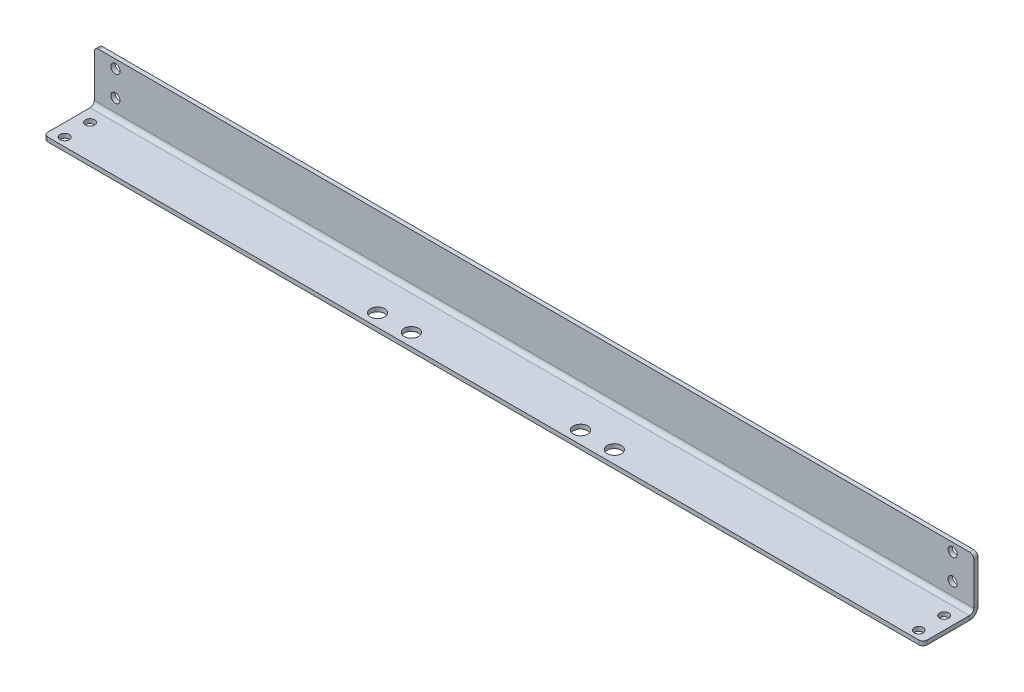
ISO-10303-21;
HEADER;
FILE_DESCRIPTION(('STEP AP214'),'2;1');
FILE_NAME('part.step','',(''),(''),'','','');
FILE_SCHEMA(('AUTOMOTIVE_DESIGN { 1 0 10303 214 1 1 1 1 }'));
ENDSEC;
DATA;
#1=APPLICATION_CONTEXT('core data for automotive mechanical design processes');
#2=APPLICATION_PROTOCOL_DEFINITION('international standard','automotive_design',2000,#1);
#3=PRODUCT_CONTEXT('',#1,'mechanical');
#4=PRODUCT('Part','Part','',(#3));
#5=PRODUCT_RELATED_PRODUCT_CATEGORY('part','',(#4));
#6=PRODUCT_DEFINITION_FORMATION('','',#4);
#7=PRODUCT_DEFINITION_CONTEXT('part definition',#1,'design');
#8=PRODUCT_DEFINITION('design','',#6,#7);
#9=PRODUCT_DEFINITION_SHAPE('','',#8);
#10=(LENGTH_UNIT() NAMED_UNIT(*) SI_UNIT(.MILLI.,.METRE.));
#11=(NAMED_UNIT(*) PLANE_ANGLE_UNIT() SI_UNIT($,.RADIAN.));
#12=(NAMED_UNIT(*) SI_UNIT($,.STERADIAN.) SOLID_ANGLE_UNIT());
#13=UNCERTAINTY_MEASURE_WITH_UNIT(LENGTH_MEASURE(1.E-05),#10,'distance_accuracy_value','');
#14=(GEOMETRIC_REPRESENTATION_CONTEXT(3) GLOBAL_UNCERTAINTY_ASSIGNED_CONTEXT((#13)) GLOBAL_UNIT_ASSIGNED_CONTEXT((#10,
#11,#12)) REPRESENTATION_CONTEXT('',''));
#15=CARTESIAN_POINT('',(0.,0.,0.));
#16=DIRECTION('',(0.,0.,1.));
#17=DIRECTION('',(1.,0.,0.));
#18=AXIS2_PLACEMENT_3D('',#15,#16,#17);
#19=CARTESIAN_POINT('',(660.4,3.175,-38.1));
#20=DIRECTION('',(1.,0.,0.));
#21=DIRECTION('',(0.,0.,-1.));
#22=AXIS2_PLACEMENT_3D('',#19,#20,#21);
#23=PLANE('',#22);
#24=DIRECTION('',(0.,0.,-1.));
#25=VECTOR('',#24,1.);
#26=CARTESIAN_POINT('',(660.4,3.175,-38.1));
#27=LINE('',#26,#25);
#28=CARTESIAN_POINT('',(660.4,3.175,-38.1));
#29=VERTEX_POINT('',#28);
#30=CARTESIAN_POINT('',(660.4,3.175,-41.275));
#31=VERTEX_POINT('',#30);
#32=EDGE_CURVE('E363',#29,#31,#27,.T.);
#33=ORIENTED_EDGE('',*,*,#32,.F.);
#34=CARTESIAN_POINT('',(660.4,3.175,-34.925));
#35=DIRECTION('',(-1.,0.,0.));
#36=DIRECTION('',(0.,0.,1.));
#37=AXIS2_PLACEMENT_3D('',#34,#35,#36);
#38=CIRCLE('',#37,3.175);
#39=CARTESIAN_POINT('',(660.4,0.,-34.925));
#40=VERTEX_POINT('',#39);
#41=EDGE_CURVE('E367',#40,#29,#38,.F.);
#42=ORIENTED_EDGE('',*,*,#41,.F.);
#43=DIRECTION('',(0.,1.,0.));
#44=VECTOR('',#43,1.);
#45=CARTESIAN_POINT('',(660.4,-3.175,-34.9249999999999));
#46=LINE('',#45,#44);
#47=CARTESIAN_POINT('',(660.4,-3.175,-34.9249999999999));
#48=VERTEX_POINT('',#47);
#49=EDGE_CURVE('E373',#48,#40,#46,.T.);
#50=ORIENTED_EDGE('',*,*,#49,.F.);
#51=CARTESIAN_POINT('',(660.4,3.175,-34.925));
#52=DIRECTION('',(1.,0.,0.));
#53=DIRECTION('',(0.,0.,-1.));
#54=AXIS2_PLACEMENT_3D('',#51,#52,#53);
#55=CIRCLE('',#54,6.35);
#56=EDGE_CURVE('E369',#48,#31,#55,.T.);
#57=ORIENTED_EDGE('',*,*,#56,.T.);
#58=EDGE_LOOP('',(#33,#42,#50,#57));
#59=FACE_BOUND('',#58,.T.);
#60=ADVANCED_FACE('F269',(#59),#23,.T.);
#61=CARTESIAN_POINT('',(660.4,-3.175,-34.9249999999999));
#62=DIRECTION('',(1.,0.,0.));
#63=DIRECTION('',(0.,0.,-1.));
#64=AXIS2_PLACEMENT_3D('',#61,#62,#63);
#65=PLANE('',#64);
#66=DIRECTION('',(0.,1.,0.));
#67=VECTOR('',#66,1.);
#68=CARTESIAN_POINT('',(660.4,0.,-41.275));
#69=LINE('',#68,#67);
#70=CARTESIAN_POINT('',(660.4,34.925,-41.275));
#71=VERTEX_POINT('',#70);
#72=EDGE_CURVE('E390',#31,#71,#69,.T.);
#73=ORIENTED_EDGE('',*,*,#72,.T.);
#74=DIRECTION('',(0.,0.,-1.));
#75=VECTOR('',#74,1.);
#76=CARTESIAN_POINT('',(660.4,34.925,-34.9249999999999));
#77=LINE('',#76,#75);
#78=CARTESIAN_POINT('',(660.4,34.925,-38.1));
#79=VERTEX_POINT('',#78);
#80=EDGE_CURVE('E293',#71,#79,#77,.F.);
#81=ORIENTED_EDGE('',*,*,#80,.T.);
#82=DIRECTION('',(0.,1.,0.));
#83=VECTOR('',#82,1.);
#84=CARTESIAN_POINT('',(660.4,0.,-38.1));
#85=LINE('',#84,#83);
#86=EDGE_CURVE('E378',#29,#79,#85,.T.);
#87=ORIENTED_EDGE('',*,*,#86,.F.);
#88=ORIENTED_EDGE('',*,*,#32,.T.);
#89=EDGE_LOOP('',(#73,#81,#87,#88));
#90=FACE_BOUND('',#89,.T.);
#91=ADVANCED_FACE('F388',(#90),#65,.T.);
#92=CARTESIAN_POINT('',(0.,0.,-34.925));
#93=DIRECTION('',(-1.,0.,0.));
#94=DIRECTION('',(0.,0.,1.));
#95=AXIS2_PLACEMENT_3D('',#92,#93,#94);
#96=PLANE('',#95);
#97=DIRECTION('',(0.,-1.,0.));
#98=VECTOR('',#97,1.);
#99=CARTESIAN_POINT('',(0.,0.,-34.925));
#100=LINE('',#99,#98);
#101=CARTESIAN_POINT('',(0.,0.,-34.925));
#102=VERTEX_POINT('',#101);
#103=CARTESIAN_POINT('',(0.,-3.175,-34.9249999999999));
#104=VERTEX_POINT('',#103);
#105=EDGE_CURVE('E455',#102,#104,#100,.T.);
#106=ORIENTED_EDGE('',*,*,#105,.F.);
#107=CARTESIAN_POINT('',(0.,3.175,-34.925));
#108=DIRECTION('',(-1.,0.,0.));
#109=DIRECTION('',(0.,0.,1.));
#110=AXIS2_PLACEMENT_3D('',#107,#108,#109);
#111=CIRCLE('',#110,3.175);
#112=CARTESIAN_POINT('',(0.,3.175,-38.1));
#113=VERTEX_POINT('',#112);
#114=EDGE_CURVE('E416',#102,#113,#111,.F.);
#115=ORIENTED_EDGE('',*,*,#114,.T.);
#116=DIRECTION('',(0.,0.,1.));
#117=VECTOR('',#116,1.);
#118=CARTESIAN_POINT('',(0.,3.175,-41.275));
#119=LINE('',#118,#117);
#120=CARTESIAN_POINT('',(0.,3.175,-41.275));
#121=VERTEX_POINT('',#120);
#122=EDGE_CURVE('E452',#121,#113,#119,.T.);
#123=ORIENTED_EDGE('',*,*,#122,.F.);
#124=CARTESIAN_POINT('',(0.,3.175,-34.925));
#125=DIRECTION('',(1.,0.,0.));
#126=DIRECTION('',(0.,0.,-1.));
#127=AXIS2_PLACEMENT_3D('',#124,#125,#126);
#128=CIRCLE('',#127,6.35);
#129=EDGE_CURVE('E425',#104,#121,#128,.T.);
#130=ORIENTED_EDGE('',*,*,#129,.F.);
#131=EDGE_LOOP('',(#106,#115,#123,#130));
#132=FACE_BOUND('',#131,.T.);
#133=ADVANCED_FACE('F648',(#132),#96,.T.);
#134=CARTESIAN_POINT('',(0.,3.175,-41.275));
#135=DIRECTION('',(-1.,0.,0.));
#136=DIRECTION('',(0.,0.,1.));
#137=AXIS2_PLACEMENT_3D('',#134,#135,#136);
#138=PLANE('',#137);
#139=DIRECTION('',(0.,0.,-1.));
#140=VECTOR('',#139,1.);
#141=CARTESIAN_POINT('',(0.,-3.175,0.));
#142=LINE('',#141,#140);
#143=CARTESIAN_POINT('',(0.,-3.175,-3.175));
#144=VERTEX_POINT('',#143);
#145=EDGE_CURVE('E422',#144,#104,#142,.T.);
#146=ORIENTED_EDGE('',*,*,#145,.F.);
#147=DIRECTION('',(0.,1.,0.));
#148=VECTOR('',#147,1.);
#149=CARTESIAN_POINT('',(0.,3.175,-3.175));
#150=LINE('',#149,#148);
#151=CARTESIAN_POINT('',(0.,0.,-3.175));
#152=VERTEX_POINT('',#151);
#153=EDGE_CURVE('E483',#144,#152,#150,.T.);
#154=ORIENTED_EDGE('',*,*,#153,.T.);
#155=DIRECTION('',(0.,0.,-1.));
#156=VECTOR('',#155,1.);
#157=CARTESIAN_POINT('',(0.,0.,0.));
#158=LINE('',#157,#156);
#159=EDGE_CURVE('E419',#152,#102,#158,.T.);
#160=ORIENTED_EDGE('',*,*,#159,.T.);
#161=ORIENTED_EDGE('',*,*,#105,.T.);
#162=EDGE_LOOP('',(#146,#154,#160,#161));
#163=FACE_BOUND('',#162,.T.);
#164=ADVANCED_FACE('F628',(#163),#138,.T.);
#165=CARTESIAN_POINT('',(660.4,0.,-41.275));
#166=DIRECTION('',(0.,0.,1.));
#167=DIRECTION('',(1.,0.,0.));
#168=AXIS2_PLACEMENT_3D('',#165,#166,#167);
#169=PLANE('',#168);
#170=CARTESIAN_POINT('',(644.525,12.7,-41.275));
#171=DIRECTION('',(0.,0.,-1.));
#172=DIRECTION('',(-1.,0.,0.));
#173=AXIS2_PLACEMENT_3D('',#170,#171,#172);
#174=CIRCLE('',#173,3.429);
#175=CARTESIAN_POINT('',(641.096,12.7,-41.275));
#176=VERTEX_POINT('',#175);
#177=EDGE_CURVE('E600',#176,#176,#174,.T.);
#178=ORIENTED_EDGE('',*,*,#177,.F.);
#179=EDGE_LOOP('',(#178));
#180=FACE_BOUND('',#179,.T.);
#181=CARTESIAN_POINT('',(15.875,31.75,-41.275));
#182=DIRECTION('',(0.,0.,-1.));
#183=DIRECTION('',(-1.,0.,0.));
#184=AXIS2_PLACEMENT_3D('',#181,#182,#183);
#185=CIRCLE('',#184,3.429);
#186=CARTESIAN_POINT('',(12.446,31.75,-41.275));
#187=VERTEX_POINT('',#186);
#188=EDGE_CURVE('E591',#187,#187,#185,.T.);
#189=ORIENTED_EDGE('',*,*,#188,.F.);
#190=EDGE_LOOP('',(#189));
#191=FACE_BOUND('',#190,.T.);
#192=CARTESIAN_POINT('',(15.875,12.7,-41.275));
#193=DIRECTION('',(0.,0.,-1.));
#194=DIRECTION('',(-1.,0.,0.));
#195=AXIS2_PLACEMENT_3D('',#192,#193,#194);
#196=CIRCLE('',#195,3.429);
#197=CARTESIAN_POINT('',(12.446,12.7,-41.275));
#198=VERTEX_POINT('',#197);
#199=EDGE_CURVE('E607',#198,#198,#196,.T.);
#200=ORIENTED_EDGE('',*,*,#199,.F.);
#201=EDGE_LOOP('',(#200));
#202=FACE_BOUND('',#201,.T.);
#203=CARTESIAN_POINT('',(644.525,31.75,-41.275));
#204=DIRECTION('',(0.,0.,-1.));
#205=DIRECTION('',(-1.,0.,0.));
#206=AXIS2_PLACEMENT_3D('',#203,#204,#205);
#207=CIRCLE('',#206,3.429);
#208=CARTESIAN_POINT('',(641.096,31.75,-41.275));
#209=VERTEX_POINT('',#208);
#210=EDGE_CURVE('E583',#209,#209,#207,.T.);
#211=ORIENTED_EDGE('',*,*,#210,.F.);
#212=EDGE_LOOP('',(#211));
#213=FACE_BOUND('',#212,.T.);
#214=DIRECTION('',(-1.,0.,0.));
#215=VECTOR('',#214,1.);
#216=CARTESIAN_POINT('',(660.4,38.1,-41.275));
#217=LINE('',#216,#215);
#218=CARTESIAN_POINT('',(657.225,38.1,-41.275));
#219=VERTEX_POINT('',#218);
#220=CARTESIAN_POINT('',(3.17500000000004,38.1,-41.275));
#221=VERTEX_POINT('',#220);
#222=EDGE_CURVE('E448',#219,#221,#217,.T.);
#223=ORIENTED_EDGE('',*,*,#222,.F.);
#224=CARTESIAN_POINT('',(657.225,34.925,-41.275));
#225=DIRECTION('',(0.,0.,1.));
#226=DIRECTION('',(1.,0.,0.));
#227=AXIS2_PLACEMENT_3D('',#224,#225,#226);
#228=CIRCLE('',#227,3.175);
#229=EDGE_CURVE('E497',#219,#71,#228,.F.);
#230=ORIENTED_EDGE('',*,*,#229,.T.);
#231=ORIENTED_EDGE('',*,*,#72,.F.);
#232=DIRECTION('',(-1.,0.,0.));
#233=VECTOR('',#232,1.);
#234=CARTESIAN_POINT('',(660.4,3.175,-41.275));
#235=LINE('',#234,#233);
#236=EDGE_CURVE('E408',#31,#121,#235,.T.);
#237=ORIENTED_EDGE('',*,*,#236,.T.);
#238=DIRECTION('',(0.,1.,0.));
#239=VECTOR('',#238,1.);
#240=CARTESIAN_POINT('',(0.,0.,-41.275));
#241=LINE('',#240,#239);
#242=CARTESIAN_POINT('',(0.,34.925,-41.275));
#243=VERTEX_POINT('',#242);
#244=EDGE_CURVE('E409',#121,#243,#241,.T.);
#245=ORIENTED_EDGE('',*,*,#244,.T.);
#246=CARTESIAN_POINT('',(3.175,34.925,-41.275));
#247=DIRECTION('',(0.,0.,1.));
#248=DIRECTION('',(1.,0.,0.));
#249=AXIS2_PLACEMENT_3D('',#246,#247,#248);
#250=CIRCLE('',#249,3.175);
#251=EDGE_CURVE('E494',#243,#221,#250,.F.);
#252=ORIENTED_EDGE('',*,*,#251,.T.);
#253=EDGE_LOOP('',(#223,#230,#231,#237,#245,#252));
#254=FACE_BOUND('',#253,.T.);
#255=ADVANCED_FACE('F515',(#180,#191,#202,#213,#254),#169,.F.);
#256=CARTESIAN_POINT('',(660.4,38.1,-38.1));
#257=DIRECTION('',(0.,1.,0.));
#258=DIRECTION('',(0.,0.,1.));
#259=AXIS2_PLACEMENT_3D('',#256,#257,#258);
#260=PLANE('',#259);
#261=DIRECTION('',(-1.,0.,0.));
#262=VECTOR('',#261,1.);
#263=CARTESIAN_POINT('',(660.4,38.1,-38.1));
#264=LINE('',#263,#262);
#265=CARTESIAN_POINT('',(657.225,38.1,-38.1));
#266=VERTEX_POINT('',#265);
#267=CARTESIAN_POINT('',(3.17500000000004,38.1,-38.1));
#268=VERTEX_POINT('',#267);
#269=EDGE_CURVE('E385',#266,#268,#264,.T.);
#270=ORIENTED_EDGE('',*,*,#269,.F.);
#271=DIRECTION('',(0.,0.,-1.));
#272=VECTOR('',#271,1.);
#273=CARTESIAN_POINT('',(657.225,38.1,-38.1));
#274=LINE('',#273,#272);
#275=EDGE_CURVE('E490',#266,#219,#274,.T.);
#276=ORIENTED_EDGE('',*,*,#275,.T.);
#277=ORIENTED_EDGE('',*,*,#222,.T.);
#278=DIRECTION('',(0.,0.,-1.));
#279=VECTOR('',#278,1.);
#280=CARTESIAN_POINT('',(3.17500000000004,38.1,-38.1));
#281=LINE('',#280,#279);
#282=EDGE_CURVE('E487',#221,#268,#281,.F.);
#283=ORIENTED_EDGE('',*,*,#282,.T.);
#284=EDGE_LOOP('',(#270,#276,#277,#283));
#285=FACE_BOUND('',#284,.T.);
#286=ADVANCED_FACE('F509',(#285),#260,.T.);
#287=CARTESIAN_POINT('',(660.4,0.,-38.1));
#288=DIRECTION('',(0.,0.,1.));
#289=DIRECTION('',(1.,0.,0.));
#290=AXIS2_PLACEMENT_3D('',#287,#288,#289);
#291=PLANE('',#290);
#292=CARTESIAN_POINT('',(644.525,12.7,-38.1));
#293=DIRECTION('',(0.,0.,-1.));
#294=DIRECTION('',(-1.,0.,0.));
#295=AXIS2_PLACEMENT_3D('',#292,#293,#294);
#296=CIRCLE('',#295,3.429);
#297=CARTESIAN_POINT('',(641.096,12.7,-38.1));
#298=VERTEX_POINT('',#297);
#299=EDGE_CURVE('E587',#298,#298,#296,.T.);
#300=ORIENTED_EDGE('',*,*,#299,.T.);
#301=EDGE_LOOP('',(#300));
#302=FACE_BOUND('',#301,.T.);
#303=CARTESIAN_POINT('',(15.875,31.75,-38.1));
#304=DIRECTION('',(0.,0.,-1.));
#305=DIRECTION('',(-1.,0.,0.));
#306=AXIS2_PLACEMENT_3D('',#303,#304,#305);
#307=CIRCLE('',#306,3.429);
#308=CARTESIAN_POINT('',(12.446,31.75,-38.1));
#309=VERTEX_POINT('',#308);
#310=EDGE_CURVE('E595',#309,#309,#307,.T.);
#311=ORIENTED_EDGE('',*,*,#310,.T.);
#312=EDGE_LOOP('',(#311));
#313=FACE_BOUND('',#312,.T.);
#314=CARTESIAN_POINT('',(15.875,12.7,-38.1));
#315=DIRECTION('',(0.,0.,-1.));
#316=DIRECTION('',(-1.,0.,0.));
#317=AXIS2_PLACEMENT_3D('',#314,#315,#316);
#318=CIRCLE('',#317,3.429);
#319=CARTESIAN_POINT('',(12.446,12.7,-38.1));
#320=VERTEX_POINT('',#319);
#321=EDGE_CURVE('E596',#320,#320,#318,.T.);
#322=ORIENTED_EDGE('',*,*,#321,.T.);
#323=EDGE_LOOP('',(#322));
#324=FACE_BOUND('',#323,.T.);
#325=CARTESIAN_POINT('',(644.525,31.75,-38.1));
#326=DIRECTION('',(0.,0.,-1.));
#327=DIRECTION('',(-1.,0.,0.));
#328=AXIS2_PLACEMENT_3D('',#325,#326,#327);
#329=CIRCLE('',#328,3.429);
#330=CARTESIAN_POINT('',(641.096,31.75,-38.1));
#331=VERTEX_POINT('',#330);
#332=EDGE_CURVE('E582',#331,#331,#329,.T.);
#333=ORIENTED_EDGE('',*,*,#332,.T.);
#334=EDGE_LOOP('',(#333));
#335=FACE_BOUND('',#334,.T.);
#336=ORIENTED_EDGE('',*,*,#86,.T.);
#337=CARTESIAN_POINT('',(657.225,34.925,-38.1));
#338=DIRECTION('',(0.,0.,1.));
#339=DIRECTION('',(1.,0.,0.));
#340=AXIS2_PLACEMENT_3D('',#337,#338,#339);
#341=CIRCLE('',#340,3.175);
#342=EDGE_CURVE('E278',#79,#266,#341,.T.);
#343=ORIENTED_EDGE('',*,*,#342,.T.);
#344=ORIENTED_EDGE('',*,*,#269,.T.);
#345=CARTESIAN_POINT('',(3.175,34.925,-38.1));
#346=DIRECTION('',(0.,0.,1.));
#347=DIRECTION('',(1.,0.,0.));
#348=AXIS2_PLACEMENT_3D('',#345,#346,#347);
#349=CIRCLE('',#348,3.175);
#350=CARTESIAN_POINT('',(0.,34.925,-38.1));
#351=VERTEX_POINT('',#350);
#352=EDGE_CURVE('E285',#268,#351,#349,.T.);
#353=ORIENTED_EDGE('',*,*,#352,.T.);
#354=DIRECTION('',(0.,1.,0.));
#355=VECTOR('',#354,1.);
#356=CARTESIAN_POINT('',(0.,0.,-38.1));
#357=LINE('',#356,#355);
#358=EDGE_CURVE('E380',#113,#351,#357,.T.);
#359=ORIENTED_EDGE('',*,*,#358,.F.);
#360=DIRECTION('',(-1.,0.,0.));
#361=VECTOR('',#360,1.);
#362=CARTESIAN_POINT('',(660.4,3.175,-38.1));
#363=LINE('',#362,#361);
#364=EDGE_CURVE('E376',#29,#113,#363,.T.);
#365=ORIENTED_EDGE('',*,*,#364,.F.);
#366=EDGE_LOOP('',(#336,#343,#344,#353,#359,#365));
#367=FACE_BOUND('',#366,.T.);
#368=ADVANCED_FACE('F377',(#302,#313,#324,#335,#367),#291,.T.);
#369=CARTESIAN_POINT('',(660.4,3.175,-34.925));
#370=DIRECTION('',(-1.,0.,0.));
#371=DIRECTION('',(0.,0.,1.));
#372=AXIS2_PLACEMENT_3D('',#369,#370,#371);
#373=CYLINDRICAL_SURFACE('',#372,3.175);
#374=ORIENTED_EDGE('',*,*,#114,.F.);
#375=DIRECTION('',(-1.,0.,0.));
#376=VECTOR('',#375,1.);
#377=CARTESIAN_POINT('',(660.4,0.,-34.925));
#378=LINE('',#377,#376);
#379=EDGE_CURVE('E386',#40,#102,#378,.T.);
#380=ORIENTED_EDGE('',*,*,#379,.F.);
#381=ORIENTED_EDGE('',*,*,#41,.T.);
#382=ORIENTED_EDGE('',*,*,#364,.T.);
#383=EDGE_LOOP('',(#374,#380,#381,#382));
#384=FACE_BOUND('',#383,.T.);
#385=ADVANCED_FACE('F393',(#384),#373,.F.);
#386=CARTESIAN_POINT('',(660.4,0.,0.));
#387=DIRECTION('',(0.,1.,0.));
#388=DIRECTION('',(0.,0.,1.));
#389=AXIS2_PLACEMENT_3D('',#386,#387,#388);
#390=PLANE('',#389);
#391=CARTESIAN_POINT('',(241.3,0.,-9.525));
#392=DIRECTION('',(0.,1.,0.));
#393=DIRECTION('',(0.,0.,1.));
#394=AXIS2_PLACEMENT_3D('',#391,#392,#393);
#395=CIRCLE('',#394,5.3578125);
#396=CARTESIAN_POINT('',(241.3,0.,-4.1671875));
#397=VERTEX_POINT('',#396);
#398=EDGE_CURVE('E413',#397,#397,#395,.T.);
#399=ORIENTED_EDGE('',*,*,#398,.F.);
#400=EDGE_LOOP('',(#399));
#401=FACE_BOUND('',#400,.T.);
#402=CARTESIAN_POINT('',(650.875,0.,-6.35));
#403=DIRECTION('',(0.,1.,0.));
#404=DIRECTION('',(0.,0.,1.));
#405=AXIS2_PLACEMENT_3D('',#402,#403,#404);
#406=CIRCLE('',#405,3.429);
#407=CARTESIAN_POINT('',(650.875,0.,-2.921));
#408=VERTEX_POINT('',#407);
#409=EDGE_CURVE('E522',#408,#408,#406,.T.);
#410=ORIENTED_EDGE('',*,*,#409,.F.);
#411=EDGE_LOOP('',(#410));
#412=FACE_BOUND('',#411,.T.);
#413=CARTESIAN_POINT('',(650.875,0.,-25.4));
#414=DIRECTION('',(0.,1.,0.));
#415=DIRECTION('',(0.,0.,1.));
#416=AXIS2_PLACEMENT_3D('',#413,#414,#415);
#417=CIRCLE('',#416,3.429);
#418=CARTESIAN_POINT('',(650.875,0.,-21.971));
#419=VERTEX_POINT('',#418);
#420=EDGE_CURVE('E526',#419,#419,#417,.T.);
#421=ORIENTED_EDGE('',*,*,#420,.F.);
#422=EDGE_LOOP('',(#421));
#423=FACE_BOUND('',#422,.T.);
#424=CARTESIAN_POINT('',(9.52500000000001,0.,-6.35));
#425=DIRECTION('',(0.,1.,0.));
#426=DIRECTION('',(0.,0.,1.));
#427=AXIS2_PLACEMENT_3D('',#424,#425,#426);
#428=CIRCLE('',#427,3.429);
#429=CARTESIAN_POINT('',(9.52500000000001,0.,-2.921));
#430=VERTEX_POINT('',#429);
#431=EDGE_CURVE('E530',#430,#430,#428,.T.);
#432=ORIENTED_EDGE('',*,*,#431,.F.);
#433=EDGE_LOOP('',(#432));
#434=FACE_BOUND('',#433,.T.);
#435=CARTESIAN_POINT('',(393.7,0.,-9.525));
#436=DIRECTION('',(0.,1.,0.));
#437=DIRECTION('',(0.,0.,1.));
#438=AXIS2_PLACEMENT_3D('',#435,#436,#437);
#439=CIRCLE('',#438,5.35781250000002);
#440=CARTESIAN_POINT('',(393.7,0.,-4.16718749999998));
#441=VERTEX_POINT('',#440);
#442=EDGE_CURVE('E534',#441,#441,#439,.T.);
#443=ORIENTED_EDGE('',*,*,#442,.F.);
#444=EDGE_LOOP('',(#443));
#445=FACE_BOUND('',#444,.T.);
#446=CARTESIAN_POINT('',(266.7,0.,-9.525));
#447=DIRECTION('',(0.,1.,0.));
#448=DIRECTION('',(0.,0.,1.));
#449=AXIS2_PLACEMENT_3D('',#446,#447,#448);
#450=CIRCLE('',#449,5.35781250000002);
#451=CARTESIAN_POINT('',(266.7,0.,-4.16718749999998));
#452=VERTEX_POINT('',#451);
#453=EDGE_CURVE('E538',#452,#452,#450,.T.);
#454=ORIENTED_EDGE('',*,*,#453,.F.);
#455=EDGE_LOOP('',(#454));
#456=FACE_BOUND('',#455,.T.);
#457=CARTESIAN_POINT('',(419.1,0.,-9.525));
#458=DIRECTION('',(0.,1.,0.));
#459=DIRECTION('',(0.,0.,1.));
#460=AXIS2_PLACEMENT_3D('',#457,#458,#459);
#461=CIRCLE('',#460,5.35781250000002);
#462=CARTESIAN_POINT('',(419.1,0.,-4.16718749999998));
#463=VERTEX_POINT('',#462);
#464=EDGE_CURVE('E542',#463,#463,#461,.T.);
#465=ORIENTED_EDGE('',*,*,#464,.F.);
#466=EDGE_LOOP('',(#465));
#467=FACE_BOUND('',#466,.T.);
#468=CARTESIAN_POINT('',(9.525,0.,-25.4));
#469=DIRECTION('',(0.,1.,0.));
#470=DIRECTION('',(0.,0.,1.));
#471=AXIS2_PLACEMENT_3D('',#468,#469,#470);
#472=CIRCLE('',#471,3.429);
#473=CARTESIAN_POINT('',(9.525,0.,-21.971));
#474=VERTEX_POINT('',#473);
#475=EDGE_CURVE('E546',#474,#474,#472,.T.);
#476=ORIENTED_EDGE('',*,*,#475,.F.);
#477=EDGE_LOOP('',(#476));
#478=FACE_BOUND('',#477,.T.);
#479=DIRECTION('',(-1.,0.,0.));
#480=VECTOR('',#479,1.);
#481=CARTESIAN_POINT('',(660.4,0.,0.));
#482=LINE('',#481,#480);
#483=CARTESIAN_POINT('',(657.225,0.,0.));
#484=VERTEX_POINT('',#483);
#485=CARTESIAN_POINT('',(3.17500000000004,0.,0.));
#486=VERTEX_POINT('',#485);
#487=EDGE_CURVE('E440',#484,#486,#482,.T.);
#488=ORIENTED_EDGE('',*,*,#487,.F.);
#489=CARTESIAN_POINT('',(657.225,0.,-3.175));
#490=DIRECTION('',(0.,1.,0.));
#491=DIRECTION('',(0.,0.,1.));
#492=AXIS2_PLACEMENT_3D('',#489,#490,#491);
#493=CIRCLE('',#492,3.175);
#494=CARTESIAN_POINT('',(660.4,0.,-3.175));
#495=VERTEX_POINT('',#494);
#496=EDGE_CURVE('E471',#484,#495,#493,.T.);
#497=ORIENTED_EDGE('',*,*,#496,.T.);
#498=DIRECTION('',(0.,0.,-1.));
#499=VECTOR('',#498,1.);
#500=CARTESIAN_POINT('',(660.4,0.,0.));
#501=LINE('',#500,#499);
#502=EDGE_CURVE('E396',#495,#40,#501,.T.);
#503=ORIENTED_EDGE('',*,*,#502,.T.);
#504=ORIENTED_EDGE('',*,*,#379,.T.);
#505=ORIENTED_EDGE('',*,*,#159,.F.);
#506=CARTESIAN_POINT('',(3.175,0.,-3.175));
#507=DIRECTION('',(0.,1.,0.));
#508=DIRECTION('',(0.,0.,1.));
#509=AXIS2_PLACEMENT_3D('',#506,#507,#508);
#510=CIRCLE('',#509,3.175);
#511=EDGE_CURVE('E468',#152,#486,#510,.T.);
#512=ORIENTED_EDGE('',*,*,#511,.T.);
#513=EDGE_LOOP('',(#488,#497,#503,#504,#505,#512));
#514=FACE_BOUND('',#513,.T.);
#515=ADVANCED_FACE('F891',(#401,#412,#423,#434,#445,#456,#467,#478,#514),#390,.T.);
#516=CARTESIAN_POINT('',(660.4,-3.175,0.));
#517=DIRECTION('',(0.,0.,1.));
#518=DIRECTION('',(1.,0.,0.));
#519=AXIS2_PLACEMENT_3D('',#516,#517,#518);
#520=PLANE('',#519);
#521=DIRECTION('',(-1.,0.,0.));
#522=VECTOR('',#521,1.);
#523=CARTESIAN_POINT('',(660.4,-3.175,0.));
#524=LINE('',#523,#522);
#525=CARTESIAN_POINT('',(657.225,-3.175,0.));
#526=VERTEX_POINT('',#525);
#527=CARTESIAN_POINT('',(3.17500000000004,-3.175,0.));
#528=VERTEX_POINT('',#527);
#529=EDGE_CURVE('E436',#526,#528,#524,.T.);
#530=ORIENTED_EDGE('',*,*,#529,.F.);
#531=DIRECTION('',(0.,1.,0.));
#532=VECTOR('',#531,1.);
#533=CARTESIAN_POINT('',(657.225,0.,0.));
#534=LINE('',#533,#532);
#535=EDGE_CURVE('E464',#526,#484,#534,.T.);
#536=ORIENTED_EDGE('',*,*,#535,.T.);
#537=ORIENTED_EDGE('',*,*,#487,.T.);
#538=DIRECTION('',(0.,1.,0.));
#539=VECTOR('',#538,1.);
#540=CARTESIAN_POINT('',(3.17500000000004,-3.175,0.));
#541=LINE('',#540,#539);
#542=EDGE_CURVE('E372',#486,#528,#541,.F.);
#543=ORIENTED_EDGE('',*,*,#542,.T.);
#544=EDGE_LOOP('',(#530,#536,#537,#543));
#545=FACE_BOUND('',#544,.T.);
#546=ADVANCED_FACE('F879',(#545),#520,.T.);
#547=CARTESIAN_POINT('',(660.4,-3.175,0.));
#548=DIRECTION('',(0.,1.,0.));
#549=DIRECTION('',(0.,0.,1.));
#550=AXIS2_PLACEMENT_3D('',#547,#548,#549);
#551=PLANE('',#550);
#552=CARTESIAN_POINT('',(241.3,-3.175,-9.525));
#553=DIRECTION('',(0.,-1.,0.));
#554=DIRECTION('',(0.,0.,-1.));
#555=AXIS2_PLACEMENT_3D('',#552,#553,#554);
#556=CIRCLE('',#555,5.3578125);
#557=CARTESIAN_POINT('',(241.3,-3.175,-14.8828125));
#558=VERTEX_POINT('',#557);
#559=EDGE_CURVE('E563',#558,#558,#556,.T.);
#560=ORIENTED_EDGE('',*,*,#559,.F.);
#561=EDGE_LOOP('',(#560));
#562=FACE_BOUND('',#561,.T.);
#563=CARTESIAN_POINT('',(650.875,-3.175,-6.35));
#564=DIRECTION('',(0.,-1.,0.));
#565=DIRECTION('',(0.,0.,-1.));
#566=AXIS2_PLACEMENT_3D('',#563,#564,#565);
#567=CIRCLE('',#566,3.429);
#568=CARTESIAN_POINT('',(650.875,-3.175,-9.779));
#569=VERTEX_POINT('',#568);
#570=EDGE_CURVE('E559',#569,#569,#567,.T.);
#571=ORIENTED_EDGE('',*,*,#570,.F.);
#572=EDGE_LOOP('',(#571));
#573=FACE_BOUND('',#572,.T.);
#574=CARTESIAN_POINT('',(650.875,-3.175,-25.4));
#575=DIRECTION('',(0.,-1.,0.));
#576=DIRECTION('',(0.,0.,-1.));
#577=AXIS2_PLACEMENT_3D('',#574,#575,#576);
#578=CIRCLE('',#577,3.429);
#579=CARTESIAN_POINT('',(650.875,-3.175,-28.829));
#580=VERTEX_POINT('',#579);
#581=EDGE_CURVE('E555',#580,#580,#578,.T.);
#582=ORIENTED_EDGE('',*,*,#581,.F.);
#583=EDGE_LOOP('',(#582));
#584=FACE_BOUND('',#583,.T.);
#585=CARTESIAN_POINT('',(9.52500000000001,-3.175,-6.35));
#586=DIRECTION('',(0.,-1.,0.));
#587=DIRECTION('',(0.,0.,-1.));
#588=AXIS2_PLACEMENT_3D('',#585,#586,#587);
#589=CIRCLE('',#588,3.429);
#590=CARTESIAN_POINT('',(9.52500000000001,-3.175,-9.779));
#591=VERTEX_POINT('',#590);
#592=EDGE_CURVE('E554',#591,#591,#589,.T.);
#593=ORIENTED_EDGE('',*,*,#592,.F.);
#594=EDGE_LOOP('',(#593));
#595=FACE_BOUND('',#594,.T.);
#596=CARTESIAN_POINT('',(393.7,-3.175,-9.525));
#597=DIRECTION('',(0.,-1.,0.));
#598=DIRECTION('',(0.,0.,-1.));
#599=AXIS2_PLACEMENT_3D('',#596,#597,#598);
#600=CIRCLE('',#599,5.35781250000002);
#601=CARTESIAN_POINT('',(393.7,-3.175,-14.8828125));
#602=VERTEX_POINT('',#601);
#603=EDGE_CURVE('E575',#602,#602,#600,.T.);
#604=ORIENTED_EDGE('',*,*,#603,.F.);
#605=EDGE_LOOP('',(#604));
#606=FACE_BOUND('',#605,.T.);
#607=CARTESIAN_POINT('',(266.7,-3.175,-9.525));
#608=DIRECTION('',(0.,-1.,0.));
#609=DIRECTION('',(0.,0.,-1.));
#610=AXIS2_PLACEMENT_3D('',#607,#608,#609);
#611=CIRCLE('',#610,5.35781250000002);
#612=CARTESIAN_POINT('',(266.7,-3.175,-14.8828125));
#613=VERTEX_POINT('',#612);
#614=EDGE_CURVE('E571',#613,#613,#611,.T.);
#615=ORIENTED_EDGE('',*,*,#614,.F.);
#616=EDGE_LOOP('',(#615));
#617=FACE_BOUND('',#616,.T.);
#618=CARTESIAN_POINT('',(419.1,-3.175,-9.525));
#619=DIRECTION('',(0.,-1.,0.));
#620=DIRECTION('',(0.,0.,-1.));
#621=AXIS2_PLACEMENT_3D('',#618,#619,#620);
#622=CIRCLE('',#621,5.35781250000002);
#623=CARTESIAN_POINT('',(419.1,-3.175,-14.8828125));
#624=VERTEX_POINT('',#623);
#625=EDGE_CURVE('E567',#624,#624,#622,.T.);
#626=ORIENTED_EDGE('',*,*,#625,.F.);
#627=EDGE_LOOP('',(#626));
#628=FACE_BOUND('',#627,.T.);
#629=CARTESIAN_POINT('',(9.525,-3.175,-25.4));
#630=DIRECTION('',(0.,-1.,0.));
#631=DIRECTION('',(0.,0.,-1.));
#632=AXIS2_PLACEMENT_3D('',#629,#630,#631);
#633=CIRCLE('',#632,3.429);
#634=CARTESIAN_POINT('',(9.525,-3.175,-28.829));
#635=VERTEX_POINT('',#634);
#636=EDGE_CURVE('E550',#635,#635,#633,.T.);
#637=ORIENTED_EDGE('',*,*,#636,.F.);
#638=EDGE_LOOP('',(#637));
#639=FACE_BOUND('',#638,.T.);
#640=DIRECTION('',(0.,0.,-1.));
#641=VECTOR('',#640,1.);
#642=CARTESIAN_POINT('',(660.4,-3.175,0.));
#643=LINE('',#642,#641);
#644=CARTESIAN_POINT('',(660.4,-3.175,-3.175));
#645=VERTEX_POINT('',#644);
#646=EDGE_CURVE('E400',#645,#48,#643,.T.);
#647=ORIENTED_EDGE('',*,*,#646,.F.);
#648=CARTESIAN_POINT('',(657.225,-3.175,-3.175));
#649=DIRECTION('',(0.,1.,0.));
#650=DIRECTION('',(0.,0.,1.));
#651=AXIS2_PLACEMENT_3D('',#648,#649,#650);
#652=CIRCLE('',#651,3.175);
#653=EDGE_CURVE('E480',#645,#526,#652,.F.);
#654=ORIENTED_EDGE('',*,*,#653,.T.);
#655=ORIENTED_EDGE('',*,*,#529,.T.);
#656=CARTESIAN_POINT('',(3.175,-3.175,-3.175));
#657=DIRECTION('',(0.,1.,0.));
#658=DIRECTION('',(0.,0.,1.));
#659=AXIS2_PLACEMENT_3D('',#656,#657,#658);
#660=CIRCLE('',#659,3.175);
#661=EDGE_CURVE('E477',#528,#144,#660,.F.);
#662=ORIENTED_EDGE('',*,*,#661,.T.);
#663=ORIENTED_EDGE('',*,*,#145,.T.);
#664=DIRECTION('',(-1.,0.,0.));
#665=VECTOR('',#664,1.);
#666=CARTESIAN_POINT('',(660.4,-3.175,-34.9249999999999));
#667=LINE('',#666,#665);
#668=EDGE_CURVE('E432',#48,#104,#667,.T.);
#669=ORIENTED_EDGE('',*,*,#668,.F.);
#670=EDGE_LOOP('',(#647,#654,#655,#662,#663,#669));
#671=FACE_BOUND('',#670,.T.);
#672=ADVANCED_FACE('F867',(#562,#573,#584,#595,#606,#617,#628,#639,#671),#551,.F.);
#673=CARTESIAN_POINT('',(660.4,3.175,-34.925));
#674=DIRECTION('',(-1.,0.,0.));
#675=DIRECTION('',(0.,0.,1.));
#676=AXIS2_PLACEMENT_3D('',#673,#674,#675);
#677=CYLINDRICAL_SURFACE('',#676,6.35);
#678=ORIENTED_EDGE('',*,*,#129,.T.);
#679=ORIENTED_EDGE('',*,*,#236,.F.);
#680=ORIENTED_EDGE('',*,*,#56,.F.);
#681=ORIENTED_EDGE('',*,*,#668,.T.);
#682=EDGE_LOOP('',(#678,#679,#680,#681));
#683=FACE_BOUND('',#682,.T.);
#684=ADVANCED_FACE('F854',(#683),#677,.T.);
#685=CARTESIAN_POINT('',(660.4,3.175,-34.925));
#686=DIRECTION('',(-1.,0.,0.));
#687=DIRECTION('',(0.,0.,1.));
#688=AXIS2_PLACEMENT_3D('',#685,#686,#687);
#689=PLANE('',#688);
#690=ORIENTED_EDGE('',*,*,#502,.F.);
#691=DIRECTION('',(0.,1.,0.));
#692=VECTOR('',#691,1.);
#693=CARTESIAN_POINT('',(660.4,-3.175,-3.175));
#694=LINE('',#693,#692);
#695=EDGE_CURVE('E474',#495,#645,#694,.F.);
#696=ORIENTED_EDGE('',*,*,#695,.T.);
#697=ORIENTED_EDGE('',*,*,#646,.T.);
#698=ORIENTED_EDGE('',*,*,#49,.T.);
#699=EDGE_LOOP('',(#690,#696,#697,#698));
#700=FACE_BOUND('',#699,.T.);
#701=ADVANCED_FACE('F841',(#700),#689,.F.);
#702=CARTESIAN_POINT('',(0.,3.175,-34.925));
#703=DIRECTION('',(-1.,0.,0.));
#704=DIRECTION('',(0.,0.,1.));
#705=AXIS2_PLACEMENT_3D('',#702,#703,#704);
#706=PLANE('',#705);
#707=ORIENTED_EDGE('',*,*,#358,.T.);
#708=DIRECTION('',(0.,0.,-1.));
#709=VECTOR('',#708,1.);
#710=CARTESIAN_POINT('',(0.,34.925,-34.925));
#711=LINE('',#710,#709);
#712=EDGE_CURVE('E12',#351,#243,#711,.T.);
#713=ORIENTED_EDGE('',*,*,#712,.T.);
#714=ORIENTED_EDGE('',*,*,#244,.F.);
#715=ORIENTED_EDGE('',*,*,#122,.T.);
#716=EDGE_LOOP('',(#707,#713,#714,#715));
#717=FACE_BOUND('',#716,.T.);
#718=ADVANCED_FACE('F828',(#717),#706,.T.);
#719=CARTESIAN_POINT('',(9.525,3.175,-25.4));
#720=DIRECTION('',(0.,-1.,0.));
#721=DIRECTION('',(0.,0.,-1.));
#722=AXIS2_PLACEMENT_3D('',#719,#720,#721);
#723=CYLINDRICAL_SURFACE('',#722,3.429);
#724=ORIENTED_EDGE('',*,*,#475,.T.);
#725=EDGE_LOOP('',(#724));
#726=FACE_BOUND('',#725,.T.);
#727=ORIENTED_EDGE('',*,*,#636,.T.);
#728=EDGE_LOOP('',(#727));
#729=FACE_BOUND('',#728,.T.);
#730=ADVANCED_FACE('F816',(#726,#729),#723,.F.);
#731=CARTESIAN_POINT('',(419.1,3.175,-9.525));
#732=DIRECTION('',(0.,-1.,0.));
#733=DIRECTION('',(0.,0.,-1.));
#734=AXIS2_PLACEMENT_3D('',#731,#732,#733);
#735=CYLINDRICAL_SURFACE('',#734,5.35781250000002);
#736=ORIENTED_EDGE('',*,*,#464,.T.);
#737=EDGE_LOOP('',(#736));
#738=FACE_BOUND('',#737,.T.);
#739=ORIENTED_EDGE('',*,*,#625,.T.);
#740=EDGE_LOOP('',(#739));
#741=FACE_BOUND('',#740,.T.);
#742=ADVANCED_FACE('F804',(#738,#741),#735,.F.);
#743=CARTESIAN_POINT('',(266.7,3.175,-9.525));
#744=DIRECTION('',(0.,-1.,0.));
#745=DIRECTION('',(0.,0.,-1.));
#746=AXIS2_PLACEMENT_3D('',#743,#744,#745);
#747=CYLINDRICAL_SURFACE('',#746,5.35781250000002);
#748=ORIENTED_EDGE('',*,*,#453,.T.);
#749=EDGE_LOOP('',(#748));
#750=FACE_BOUND('',#749,.T.);
#751=ORIENTED_EDGE('',*,*,#614,.T.);
#752=EDGE_LOOP('',(#751));
#753=FACE_BOUND('',#752,.T.);
#754=ADVANCED_FACE('F793',(#750,#753),#747,.F.);
#755=CARTESIAN_POINT('',(393.7,3.175,-9.525));
#756=DIRECTION('',(0.,-1.,0.));
#757=DIRECTION('',(0.,0.,-1.));
#758=AXIS2_PLACEMENT_3D('',#755,#756,#757);
#759=CYLINDRICAL_SURFACE('',#758,5.35781250000002);
#760=ORIENTED_EDGE('',*,*,#442,.T.);
#761=EDGE_LOOP('',(#760));
#762=FACE_BOUND('',#761,.T.);
#763=ORIENTED_EDGE('',*,*,#603,.T.);
#764=EDGE_LOOP('',(#763));
#765=FACE_BOUND('',#764,.T.);
#766=ADVANCED_FACE('F781',(#762,#765),#759,.F.);
#767=CARTESIAN_POINT('',(9.52500000000001,3.175,-6.35));
#768=DIRECTION('',(0.,-1.,0.));
#769=DIRECTION('',(0.,0.,-1.));
#770=AXIS2_PLACEMENT_3D('',#767,#768,#769);
#771=CYLINDRICAL_SURFACE('',#770,3.429);
#772=ORIENTED_EDGE('',*,*,#431,.T.);
#773=EDGE_LOOP('',(#772));
#774=FACE_BOUND('',#773,.T.);
#775=ORIENTED_EDGE('',*,*,#592,.T.);
#776=EDGE_LOOP('',(#775));
#777=FACE_BOUND('',#776,.T.);
#778=ADVANCED_FACE('F769',(#774,#777),#771,.F.);
#779=CARTESIAN_POINT('',(650.875,3.175,-25.4));
#780=DIRECTION('',(0.,-1.,0.));
#781=DIRECTION('',(0.,0.,-1.));
#782=AXIS2_PLACEMENT_3D('',#779,#780,#781);
#783=CYLINDRICAL_SURFACE('',#782,3.429);
#784=ORIENTED_EDGE('',*,*,#420,.T.);
#785=EDGE_LOOP('',(#784));
#786=FACE_BOUND('',#785,.T.);
#787=ORIENTED_EDGE('',*,*,#581,.T.);
#788=EDGE_LOOP('',(#787));
#789=FACE_BOUND('',#788,.T.);
#790=ADVANCED_FACE('F757',(#786,#789),#783,.F.);
#791=CARTESIAN_POINT('',(650.875,3.175,-6.35));
#792=DIRECTION('',(0.,-1.,0.));
#793=DIRECTION('',(0.,0.,-1.));
#794=AXIS2_PLACEMENT_3D('',#791,#792,#793);
#795=CYLINDRICAL_SURFACE('',#794,3.429);
#796=ORIENTED_EDGE('',*,*,#409,.T.);
#797=EDGE_LOOP('',(#796));
#798=FACE_BOUND('',#797,.T.);
#799=ORIENTED_EDGE('',*,*,#570,.T.);
#800=EDGE_LOOP('',(#799));
#801=FACE_BOUND('',#800,.T.);
#802=ADVANCED_FACE('F744',(#798,#801),#795,.F.);
#803=CARTESIAN_POINT('',(241.3,3.175,-9.525));
#804=DIRECTION('',(0.,-1.,0.));
#805=DIRECTION('',(0.,0.,-1.));
#806=AXIS2_PLACEMENT_3D('',#803,#804,#805);
#807=CYLINDRICAL_SURFACE('',#806,5.3578125);
#808=ORIENTED_EDGE('',*,*,#398,.T.);
#809=EDGE_LOOP('',(#808));
#810=FACE_BOUND('',#809,.T.);
#811=ORIENTED_EDGE('',*,*,#559,.T.);
#812=EDGE_LOOP('',(#811));
#813=FACE_BOUND('',#812,.T.);
#814=ADVANCED_FACE('F656',(#810,#813),#807,.F.);
#815=CARTESIAN_POINT('',(657.225,-3.175,-3.175));
#816=DIRECTION('',(0.,-1.,0.));
#817=DIRECTION('',(0.,0.,-1.));
#818=AXIS2_PLACEMENT_3D('',#815,#816,#817);
#819=CYLINDRICAL_SURFACE('',#818,3.175);
#820=ORIENTED_EDGE('',*,*,#653,.F.);
#821=ORIENTED_EDGE('',*,*,#695,.F.);
#822=ORIENTED_EDGE('',*,*,#496,.F.);
#823=ORIENTED_EDGE('',*,*,#535,.F.);
#824=EDGE_LOOP('',(#820,#821,#822,#823));
#825=FACE_BOUND('',#824,.T.);
#826=ADVANCED_FACE('F652',(#825),#819,.T.);
#827=CARTESIAN_POINT('',(3.175,3.175,-3.175));
#828=DIRECTION('',(0.,1.,0.));
#829=DIRECTION('',(0.,0.,1.));
#830=AXIS2_PLACEMENT_3D('',#827,#828,#829);
#831=CYLINDRICAL_SURFACE('',#830,3.175);
#832=ORIENTED_EDGE('',*,*,#661,.F.);
#833=ORIENTED_EDGE('',*,*,#542,.F.);
#834=ORIENTED_EDGE('',*,*,#511,.F.);
#835=ORIENTED_EDGE('',*,*,#153,.F.);
#836=EDGE_LOOP('',(#832,#833,#834,#835));
#837=FACE_BOUND('',#836,.T.);
#838=ADVANCED_FACE('F655',(#837),#831,.T.);
#839=CARTESIAN_POINT('',(657.225,34.925,-38.1));
#840=DIRECTION('',(0.,0.,-1.));
#841=DIRECTION('',(-1.,0.,0.));
#842=AXIS2_PLACEMENT_3D('',#839,#840,#841);
#843=CYLINDRICAL_SURFACE('',#842,3.175);
#844=ORIENTED_EDGE('',*,*,#342,.F.);
#845=ORIENTED_EDGE('',*,*,#80,.F.);
#846=ORIENTED_EDGE('',*,*,#229,.F.);
#847=ORIENTED_EDGE('',*,*,#275,.F.);
#848=EDGE_LOOP('',(#844,#845,#846,#847));
#849=FACE_BOUND('',#848,.T.);
#850=ADVANCED_FACE('F512',(#849),#843,.T.);
#851=CARTESIAN_POINT('',(3.175,34.925,-34.925));
#852=DIRECTION('',(0.,0.,-1.));
#853=DIRECTION('',(-1.,0.,0.));
#854=AXIS2_PLACEMENT_3D('',#851,#852,#853);
#855=CYLINDRICAL_SURFACE('',#854,3.175);
#856=ORIENTED_EDGE('',*,*,#352,.F.);
#857=ORIENTED_EDGE('',*,*,#282,.F.);
#858=ORIENTED_EDGE('',*,*,#251,.F.);
#859=ORIENTED_EDGE('',*,*,#712,.F.);
#860=EDGE_LOOP('',(#856,#857,#858,#859));
#861=FACE_BOUND('',#860,.T.);
#862=ADVANCED_FACE('F271',(#861),#855,.T.);
#863=CARTESIAN_POINT('',(644.525,31.75,-38.1));
#864=DIRECTION('',(0.,0.,-1.));
#865=DIRECTION('',(-1.,0.,0.));
#866=AXIS2_PLACEMENT_3D('',#863,#864,#865);
#867=CYLINDRICAL_SURFACE('',#866,3.429);
#868=ORIENTED_EDGE('',*,*,#332,.F.);
#869=EDGE_LOOP('',(#868));
#870=FACE_BOUND('',#869,.T.);
#871=ORIENTED_EDGE('',*,*,#210,.T.);
#872=EDGE_LOOP('',(#871));
#873=FACE_BOUND('',#872,.T.);
#874=ADVANCED_FACE('F622',(#870,#873),#867,.F.);
#875=CARTESIAN_POINT('',(15.875,12.7,-38.1));
#876=DIRECTION('',(0.,0.,-1.));
#877=DIRECTION('',(-1.,0.,0.));
#878=AXIS2_PLACEMENT_3D('',#875,#876,#877);
#879=CYLINDRICAL_SURFACE('',#878,3.429);
#880=ORIENTED_EDGE('',*,*,#321,.F.);
#881=EDGE_LOOP('',(#880));
#882=FACE_BOUND('',#881,.T.);
#883=ORIENTED_EDGE('',*,*,#199,.T.);
#884=EDGE_LOOP('',(#883));
#885=FACE_BOUND('',#884,.T.);
#886=ADVANCED_FACE('F618',(#882,#885),#879,.F.);
#887=CARTESIAN_POINT('',(15.875,31.75,-38.1));
#888=DIRECTION('',(0.,0.,-1.));
#889=DIRECTION('',(-1.,0.,0.));
#890=AXIS2_PLACEMENT_3D('',#887,#888,#889);
#891=CYLINDRICAL_SURFACE('',#890,3.429);
#892=ORIENTED_EDGE('',*,*,#310,.F.);
#893=EDGE_LOOP('',(#892));
#894=FACE_BOUND('',#893,.T.);
#895=ORIENTED_EDGE('',*,*,#188,.T.);
#896=EDGE_LOOP('',(#895));
#897=FACE_BOUND('',#896,.T.);
#898=ADVANCED_FACE('F621',(#894,#897),#891,.F.);
#899=CARTESIAN_POINT('',(644.525,12.7,-38.1));
#900=DIRECTION('',(0.,0.,-1.));
#901=DIRECTION('',(-1.,0.,0.));
#902=AXIS2_PLACEMENT_3D('',#899,#900,#901);
#903=CYLINDRICAL_SURFACE('',#902,3.429);
#904=ORIENTED_EDGE('',*,*,#299,.F.);
#905=EDGE_LOOP('',(#904));
#906=FACE_BOUND('',#905,.T.);
#907=ORIENTED_EDGE('',*,*,#177,.T.);
#908=EDGE_LOOP('',(#907));
#909=FACE_BOUND('',#908,.T.);
#910=ADVANCED_FACE('F690',(#906,#909),#903,.F.);
#911=CLOSED_SHELL('',(#60,#91,#133,#164,#255,#286,#368,#385,#515,#546,#672,#684,#701,#718,#730,
#742,#754,#766,#778,#790,#802,#814,#826,#838,#850,#862,#874,#886,#898,#910));
#912=MANIFOLD_SOLID_BREP('B2',#911);
#913=ADVANCED_BREP_SHAPE_REPRESENTATION('',(#18,#912),#14);
#914=SHAPE_DEFINITION_REPRESENTATION(#9,#913);
ENDSEC;
END-ISO-10303-21;
